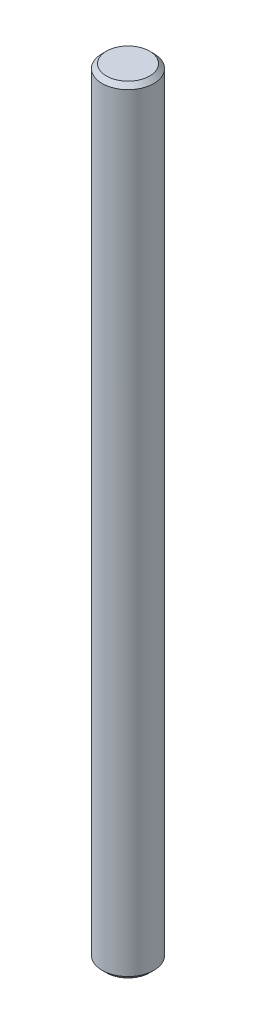
ISO-10303-21;
HEADER;
FILE_DESCRIPTION(('STEP AP214'),'2;1');
FILE_NAME('part.step','',(''),(''),'','','');
FILE_SCHEMA(('AUTOMOTIVE_DESIGN { 1 0 10303 214 1 1 1 1 }'));
ENDSEC;
DATA;
#1=APPLICATION_CONTEXT('core data for automotive mechanical design processes');
#2=APPLICATION_PROTOCOL_DEFINITION('international standard','automotive_design',2000,#1);
#3=PRODUCT_CONTEXT('',#1,'mechanical');
#4=PRODUCT('Part','Part','',(#3));
#5=PRODUCT_RELATED_PRODUCT_CATEGORY('part','',(#4));
#6=PRODUCT_DEFINITION_FORMATION('','',#4);
#7=PRODUCT_DEFINITION_CONTEXT('part definition',#1,'design');
#8=PRODUCT_DEFINITION('design','',#6,#7);
#9=PRODUCT_DEFINITION_SHAPE('','',#8);
#10=(LENGTH_UNIT() NAMED_UNIT(*) SI_UNIT(.MILLI.,.METRE.));
#11=(NAMED_UNIT(*) PLANE_ANGLE_UNIT() SI_UNIT($,.RADIAN.));
#12=(NAMED_UNIT(*) SI_UNIT($,.STERADIAN.) SOLID_ANGLE_UNIT());
#13=UNCERTAINTY_MEASURE_WITH_UNIT(LENGTH_MEASURE(1.E-05),#10,'distance_accuracy_value','');
#14=(GEOMETRIC_REPRESENTATION_CONTEXT(3) GLOBAL_UNCERTAINTY_ASSIGNED_CONTEXT((#13)) GLOBAL_UNIT_ASSIGNED_CONTEXT((#10,
#11,#12)) REPRESENTATION_CONTEXT('',''));
#15=CARTESIAN_POINT('',(0.,0.,0.));
#16=DIRECTION('',(0.,0.,1.));
#17=DIRECTION('',(1.,0.,0.));
#18=AXIS2_PLACEMENT_3D('',#15,#16,#17);
#19=CARTESIAN_POINT('',(0.,90.,0.));
#20=DIRECTION('',(0.,-1.,0.));
#21=DIRECTION('',(0.,0.,-1.));
#22=AXIS2_PLACEMENT_3D('',#19,#20,#21);
#23=CYLINDRICAL_SURFACE('',#22,3.);
#24=CARTESIAN_POINT('',(0.,0.500000000000042,0.));
#25=DIRECTION('',(0.,1.,0.));
#26=DIRECTION('',(0.,0.,1.));
#27=AXIS2_PLACEMENT_3D('',#24,#25,#26);
#28=CIRCLE('',#27,3.);
#29=CARTESIAN_POINT('',(0.,0.500000000000042,-3.));
#30=VERTEX_POINT('',#29);
#31=EDGE_CURVE('E51',#30,#30,#28,.T.);
#32=CARTESIAN_POINT('',(0.,89.5,0.));
#33=DIRECTION('',(0.,1.,0.));
#34=DIRECTION('',(0.,0.,1.));
#35=AXIS2_PLACEMENT_3D('',#32,#33,#34);
#36=CIRCLE('',#35,3.);
#37=CARTESIAN_POINT('',(0.,89.5,-3.));
#38=VERTEX_POINT('',#37);
#39=EDGE_CURVE('E55',#38,#38,#36,.F.);
#40=CARTESIAN_POINT('',(0.,0.500000000000042,-3.));
#41=CARTESIAN_POINT('',(0.,1.42708333333338,-3.));
#42=CARTESIAN_POINT('',(0.,2.35416666666671,-3.));
#43=CARTESIAN_POINT('',(0.,4.20833333333337,-3.));
#44=CARTESIAN_POINT('',(0.,5.13541666666671,-3.));
#45=CARTESIAN_POINT('',(0.,6.98958333333337,-3.));
#46=CARTESIAN_POINT('',(0.,7.91666666666671,-3.));
#47=CARTESIAN_POINT('',(0.,9.77083333333337,-3.));
#48=CARTESIAN_POINT('',(0.,10.6979166666667,-3.));
#49=CARTESIAN_POINT('',(0.,12.5520833333334,-3.));
#50=CARTESIAN_POINT('',(0.,13.4791666666667,-3.));
#51=CARTESIAN_POINT('',(0.,15.3333333333334,-3.));
#52=CARTESIAN_POINT('',(0.,16.2604166666667,-3.));
#53=CARTESIAN_POINT('',(0.,18.1145833333334,-3.));
#54=CARTESIAN_POINT('',(0.,19.0416666666667,-3.));
#55=CARTESIAN_POINT('',(0.,20.8958333333334,-3.));
#56=CARTESIAN_POINT('',(0.,21.8229166666667,-3.));
#57=CARTESIAN_POINT('',(0.,23.6770833333334,-3.));
#58=CARTESIAN_POINT('',(0.,24.6041666666667,-3.));
#59=CARTESIAN_POINT('',(0.,26.4583333333334,-3.));
#60=CARTESIAN_POINT('',(0.,27.3854166666667,-3.));
#61=CARTESIAN_POINT('',(0.,29.2395833333334,-3.));
#62=CARTESIAN_POINT('',(0.,30.1666666666667,-3.));
#63=CARTESIAN_POINT('',(0.,32.0208333333334,-3.));
#64=CARTESIAN_POINT('',(0.,32.9479166666667,-3.));
#65=CARTESIAN_POINT('',(0.,34.8020833333334,-3.));
#66=CARTESIAN_POINT('',(0.,35.7291666666667,-3.));
#67=CARTESIAN_POINT('',(0.,37.5833333333334,-3.));
#68=CARTESIAN_POINT('',(0.,38.5104166666667,-3.));
#69=CARTESIAN_POINT('',(0.,40.3645833333334,-3.));
#70=CARTESIAN_POINT('',(0.,41.2916666666667,-3.));
#71=CARTESIAN_POINT('',(0.,43.1458333333334,-3.));
#72=CARTESIAN_POINT('',(0.,44.0729166666667,-3.));
#73=CARTESIAN_POINT('',(0.,45.9270833333334,-3.));
#74=CARTESIAN_POINT('',(0.,46.8541666666667,-3.));
#75=CARTESIAN_POINT('',(0.,48.7083333333334,-3.));
#76=CARTESIAN_POINT('',(0.,49.6354166666667,-3.));
#77=CARTESIAN_POINT('',(0.,51.4895833333334,-3.));
#78=CARTESIAN_POINT('',(0.,52.4166666666667,-3.));
#79=CARTESIAN_POINT('',(0.,54.2708333333334,-3.));
#80=CARTESIAN_POINT('',(0.,55.1979166666667,-3.));
#81=CARTESIAN_POINT('',(0.,57.0520833333334,-3.));
#82=CARTESIAN_POINT('',(0.,57.9791666666667,-3.));
#83=CARTESIAN_POINT('',(0.,59.8333333333334,-3.));
#84=CARTESIAN_POINT('',(0.,60.7604166666667,-3.));
#85=CARTESIAN_POINT('',(0.,62.6145833333333,-3.));
#86=CARTESIAN_POINT('',(0.,63.5416666666667,-3.));
#87=CARTESIAN_POINT('',(0.,65.3958333333333,-3.));
#88=CARTESIAN_POINT('',(0.,66.3229166666667,-3.));
#89=CARTESIAN_POINT('',(0.,68.1770833333333,-3.));
#90=CARTESIAN_POINT('',(0.,69.1041666666667,-3.));
#91=CARTESIAN_POINT('',(0.,70.9583333333333,-3.));
#92=CARTESIAN_POINT('',(0.,71.8854166666667,-3.));
#93=CARTESIAN_POINT('',(0.,73.7395833333333,-3.));
#94=CARTESIAN_POINT('',(0.,74.6666666666667,-3.));
#95=CARTESIAN_POINT('',(0.,76.5208333333333,-3.));
#96=CARTESIAN_POINT('',(0.,77.4479166666667,-3.));
#97=CARTESIAN_POINT('',(0.,79.3020833333333,-3.));
#98=CARTESIAN_POINT('',(0.,80.2291666666667,-3.));
#99=CARTESIAN_POINT('',(0.,82.0833333333333,-3.));
#100=CARTESIAN_POINT('',(0.,83.0104166666667,-3.));
#101=CARTESIAN_POINT('',(0.,84.8645833333333,-3.));
#102=CARTESIAN_POINT('',(0.,85.7916666666667,-3.));
#103=CARTESIAN_POINT('',(0.,87.6458333333333,-3.));
#104=CARTESIAN_POINT('',(0.,88.5729166666667,-3.));
#105=CARTESIAN_POINT('',(0.,89.5,-3.));
#106=B_SPLINE_CURVE_WITH_KNOTS('',3,(#40,#41,#42,#43,#44,#45,#46,#47,#48,#49,#50,#51,#52,#53,
#54,#55,#56,#57,#58,#59,#60,#61,#62,#63,#64,#65,#66,#67,#68,#69,#70,#71,#72,#73,#74,#75,#76,#77,
#78,#79,#80,#81,#82,#83,#84,#85,#86,#87,#88,#89,#90,#91,#92,#93,#94,#95,#96,#97,#98,#99,#100,
#101,#102,#103,#104,#105),.UNSPECIFIED.,.F.,.F.,(4,2,2,2,2,2,2,2,2,2,2,2,2,2,2,2,2,2,2,2,2,2,2,
2,2,2,2,2,2,2,2,2,4),(0.,2.78125,5.5625,8.34375,11.125,13.90625,16.6875,19.46875,22.25,25.03125,
27.8125,30.59375,33.375,36.15625,38.9375,41.71875,44.5,47.28125,50.0625,52.84375,55.625,
58.40625,61.1875,63.96875,66.75,69.53125,72.3125,75.09375,77.875,80.65625,83.4375,86.21875,89.),.UNSPECIFIED.);
#107=EDGE_CURVE('BSEAM39',#30,#38,#106,.T.);
#108=ORIENTED_EDGE('',*,*,#31,.T.);
#109=ORIENTED_EDGE('',*,*,#39,.T.);
#110=ORIENTED_EDGE('',*,*,#107,.T.);
#111=ORIENTED_EDGE('',*,*,#107,.F.);
#112=EDGE_LOOP('',(#108,#110,#109,#111));
#113=FACE_BOUND('',#112,.T.);
#114=ADVANCED_FACE('F39',(#113),#23,.T.);
#115=CARTESIAN_POINT('',(0.,90.,0.));
#116=DIRECTION('',(0.,1.,0.));
#117=DIRECTION('',(0.,0.,1.));
#118=AXIS2_PLACEMENT_3D('',#115,#116,#117);
#119=PLANE('',#118);
#120=CARTESIAN_POINT('',(0.,90.,0.));
#121=DIRECTION('',(0.,1.,0.));
#122=DIRECTION('',(0.,0.,1.));
#123=AXIS2_PLACEMENT_3D('',#120,#121,#122);
#124=CIRCLE('',#123,2.50000000000002);
#125=CARTESIAN_POINT('',(0.,90.,2.50000000000002));
#126=VERTEX_POINT('',#125);
#127=EDGE_CURVE('E10',#126,#126,#124,.T.);
#128=ORIENTED_EDGE('',*,*,#127,.T.);
#129=EDGE_LOOP('',(#128));
#130=FACE_BOUND('',#129,.T.);
#131=ADVANCED_FACE('F71',(#130),#119,.T.);
#132=CARTESIAN_POINT('',(0.,0.,0.));
#133=DIRECTION('',(0.,1.,0.));
#134=DIRECTION('',(0.,0.,1.));
#135=AXIS2_PLACEMENT_3D('',#132,#133,#134);
#136=PLANE('',#135);
#137=CARTESIAN_POINT('',(0.,0.,0.));
#138=DIRECTION('',(0.,1.,0.));
#139=DIRECTION('',(0.,0.,1.));
#140=AXIS2_PLACEMENT_3D('',#137,#138,#139);
#141=CIRCLE('',#140,2.49999999999996);
#142=CARTESIAN_POINT('',(0.,0.,2.49999999999996));
#143=VERTEX_POINT('',#142);
#144=EDGE_CURVE('E47',#143,#143,#141,.F.);
#145=ORIENTED_EDGE('',*,*,#144,.T.);
#146=EDGE_LOOP('',(#145));
#147=FACE_BOUND('',#146,.T.);
#148=ADVANCED_FACE('F68',(#147),#136,.F.);
#149=CARTESIAN_POINT('',(0.,0.500000000000042,0.));
#150=DIRECTION('',(0.,1.,0.));
#151=DIRECTION('',(0.,0.,1.));
#152=AXIS2_PLACEMENT_3D('',#149,#150,#151);
#153=CONICAL_SURFACE('',#152,3.,0.785398163397447);
#154=ORIENTED_EDGE('',*,*,#144,.F.);
#155=EDGE_LOOP('',(#154));
#156=FACE_BOUND('',#155,.T.);
#157=ORIENTED_EDGE('',*,*,#31,.F.);
#158=EDGE_LOOP('',(#157));
#159=FACE_BOUND('',#158,.T.);
#160=ADVANCED_FACE('F64',(#156,#159),#153,.T.);
#161=CARTESIAN_POINT('',(0.,90.,0.));
#162=DIRECTION('',(0.,-1.,0.));
#163=DIRECTION('',(0.,0.,-1.));
#164=AXIS2_PLACEMENT_3D('',#161,#162,#163);
#165=CONICAL_SURFACE('',#164,2.50000000000002,0.78539816339746);
#166=ORIENTED_EDGE('',*,*,#39,.F.);
#167=EDGE_LOOP('',(#166));
#168=FACE_BOUND('',#167,.T.);
#169=ORIENTED_EDGE('',*,*,#127,.F.);
#170=EDGE_LOOP('',(#169));
#171=FACE_BOUND('',#170,.T.);
#172=ADVANCED_FACE('F42',(#168,#171),#165,.T.);
#173=CLOSED_SHELL('',(#114,#131,#148,#160,#172));
#174=MANIFOLD_SOLID_BREP('B2',#173);
#175=ADVANCED_BREP_SHAPE_REPRESENTATION('',(#18,#174),#14);
#176=SHAPE_DEFINITION_REPRESENTATION(#9,#175);
ENDSEC;
END-ISO-10303-21;
